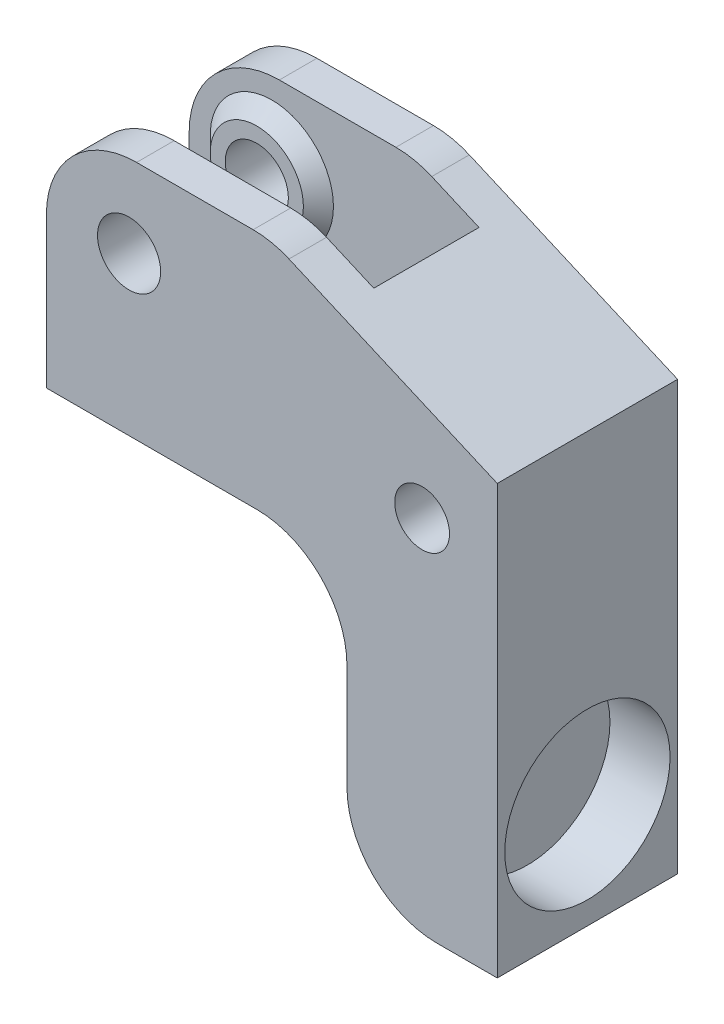
ISO-10303-21;
HEADER;
FILE_DESCRIPTION(('STEP AP214'),'2;1');
FILE_NAME('part.step','',(''),(''),'','','');
FILE_SCHEMA(('AUTOMOTIVE_DESIGN { 1 0 10303 214 1 1 1 1 }'));
ENDSEC;
DATA;
#1=APPLICATION_CONTEXT('core data for automotive mechanical design processes');
#2=APPLICATION_PROTOCOL_DEFINITION('international standard','automotive_design',2000,#1);
#3=PRODUCT_CONTEXT('',#1,'mechanical');
#4=PRODUCT('Part','Part','',(#3));
#5=PRODUCT_RELATED_PRODUCT_CATEGORY('part','',(#4));
#6=PRODUCT_DEFINITION_FORMATION('','',#4);
#7=PRODUCT_DEFINITION_CONTEXT('part definition',#1,'design');
#8=PRODUCT_DEFINITION('design','',#6,#7);
#9=PRODUCT_DEFINITION_SHAPE('','',#8);
#10=(LENGTH_UNIT() NAMED_UNIT(*) SI_UNIT(.MILLI.,.METRE.));
#11=(NAMED_UNIT(*) PLANE_ANGLE_UNIT() SI_UNIT($,.RADIAN.));
#12=(NAMED_UNIT(*) SI_UNIT($,.STERADIAN.) SOLID_ANGLE_UNIT());
#13=UNCERTAINTY_MEASURE_WITH_UNIT(LENGTH_MEASURE(1.E-05),#10,'distance_accuracy_value','');
#14=(GEOMETRIC_REPRESENTATION_CONTEXT(3) GLOBAL_UNCERTAINTY_ASSIGNED_CONTEXT((#13)) GLOBAL_UNIT_ASSIGNED_CONTEXT((#10,
#11,#12)) REPRESENTATION_CONTEXT('',''));
#15=CARTESIAN_POINT('',(0.,0.,0.));
#16=DIRECTION('',(0.,0.,1.));
#17=DIRECTION('',(1.,0.,0.));
#18=AXIS2_PLACEMENT_3D('',#15,#16,#17);
#19=CARTESIAN_POINT('',(0.,0.,2.5));
#20=DIRECTION('',(0.,0.,1.));
#21=DIRECTION('',(1.,0.,0.));
#22=AXIS2_PLACEMENT_3D('',#19,#20,#21);
#23=PLANE('',#22);
#24=DIRECTION('',(-0.917555625309924,0.397607437634301,0.));
#25=VECTOR('',#24,1.);
#26=CARTESIAN_POINT('',(15.,16.,2.5));
#27=LINE('',#26,#25);
#28=CARTESIAN_POINT('',(19.2848283626373,14.1432410428572,2.5));
#29=VERTEX_POINT('',#28);
#30=CARTESIAN_POINT('',(16.1415374957087,15.5053337518595,2.5));
#31=VERTEX_POINT('',#30);
#32=EDGE_CURVE('E202',#29,#31,#27,.T.);
#33=ORIENTED_EDGE('',*,*,#32,.T.);
#34=CARTESIAN_POINT('',(13.7558928699029,10.,2.5));
#35=DIRECTION('',(0.,0.,1.));
#36=DIRECTION('',(1.,0.,0.));
#37=AXIS2_PLACEMENT_3D('',#34,#35,#36);
#38=CIRCLE('',#37,6.);
#39=CARTESIAN_POINT('',(13.7558928699029,16.,2.5));
#40=VERTEX_POINT('',#39);
#41=EDGE_CURVE('E199',#40,#31,#38,.F.);
#42=ORIENTED_EDGE('',*,*,#41,.F.);
#43=DIRECTION('',(-1.,0.,0.));
#44=VECTOR('',#43,1.);
#45=CARTESIAN_POINT('',(0.,16.,2.5));
#46=LINE('',#45,#44);
#47=CARTESIAN_POINT('',(6.,16.,2.5));
#48=VERTEX_POINT('',#47);
#49=EDGE_CURVE('E197',#40,#48,#46,.T.);
#50=ORIENTED_EDGE('',*,*,#49,.T.);
#51=CARTESIAN_POINT('',(6.,10.,2.5));
#52=DIRECTION('',(0.,0.,1.));
#53=DIRECTION('',(1.,0.,0.));
#54=AXIS2_PLACEMENT_3D('',#51,#52,#53);
#55=CIRCLE('',#54,6.);
#56=CARTESIAN_POINT('',(0.,10.,2.5));
#57=VERTEX_POINT('',#56);
#58=EDGE_CURVE('E303',#57,#48,#55,.F.);
#59=ORIENTED_EDGE('',*,*,#58,.F.);
#60=DIRECTION('',(0.,1.,0.));
#61=VECTOR('',#60,1.);
#62=CARTESIAN_POINT('',(0.,2.,2.5));
#63=LINE('',#62,#61);
#64=CARTESIAN_POINT('',(0.,2.,2.5));
#65=VERTEX_POINT('',#64);
#66=EDGE_CURVE('E183',#65,#57,#63,.T.);
#67=ORIENTED_EDGE('',*,*,#66,.F.);
#68=DIRECTION('',(-1.,0.,0.));
#69=VECTOR('',#68,1.);
#70=CARTESIAN_POINT('',(12.,2.,2.5));
#71=LINE('',#70,#69);
#72=CARTESIAN_POINT('',(12.,2.,2.5));
#73=VERTEX_POINT('',#72);
#74=EDGE_CURVE('E190',#73,#65,#71,.T.);
#75=ORIENTED_EDGE('',*,*,#74,.F.);
#76=DIRECTION('',(-0.514437792541648,-0.857527700779908,0.));
#77=VECTOR('',#76,1.);
#78=CARTESIAN_POINT('',(22.,18.669220520195,2.5));
#79=LINE('',#78,#77);
#80=EDGE_CURVE('E175',#29,#73,#79,.T.);
#81=ORIENTED_EDGE('',*,*,#80,.F.);
#82=EDGE_LOOP('',(#33,#42,#50,#59,#67,#75,#81));
#83=FACE_BOUND('',#82,.T.);
#84=CARTESIAN_POINT('',(5.5,10.5,2.5));
#85=DIRECTION('',(0.,0.,1.));
#86=DIRECTION('',(1.,0.,0.));
#87=AXIS2_PLACEMENT_3D('',#84,#85,#86);
#88=CIRCLE('',#87,4.09999999999999);
#89=CARTESIAN_POINT('',(9.59999999999999,10.5,2.5));
#90=VERTEX_POINT('',#89);
#91=EDGE_CURVE('E344',#90,#90,#88,.T.);
#92=ORIENTED_EDGE('',*,*,#91,.F.);
#93=EDGE_LOOP('',(#92));
#94=FACE_BOUND('',#93,.T.);
#95=ADVANCED_FACE('F34',(#83,#94),#23,.T.);
#96=CARTESIAN_POINT('',(0.,0.,9.5));
#97=DIRECTION('',(0.,0.,1.));
#98=DIRECTION('',(1.,0.,0.));
#99=AXIS2_PLACEMENT_3D('',#96,#97,#98);
#100=PLANE('',#99);
#101=DIRECTION('',(-0.514437792541648,-0.857527700779908,0.));
#102=VECTOR('',#101,1.);
#103=CARTESIAN_POINT('',(22.,18.669220520195,9.5));
#104=LINE('',#103,#102);
#105=CARTESIAN_POINT('',(19.2848283626373,14.1432410428572,9.5));
#106=VERTEX_POINT('',#105);
#107=CARTESIAN_POINT('',(12.,2.,9.5));
#108=VERTEX_POINT('',#107);
#109=EDGE_CURVE('E160',#106,#108,#104,.T.);
#110=ORIENTED_EDGE('',*,*,#109,.T.);
#111=DIRECTION('',(-1.,0.,0.));
#112=VECTOR('',#111,1.);
#113=CARTESIAN_POINT('',(12.,2.,9.5));
#114=LINE('',#113,#112);
#115=CARTESIAN_POINT('',(0.,2.,9.5));
#116=VERTEX_POINT('',#115);
#117=EDGE_CURVE('E165',#108,#116,#114,.T.);
#118=ORIENTED_EDGE('',*,*,#117,.T.);
#119=DIRECTION('',(0.,1.,0.));
#120=VECTOR('',#119,1.);
#121=CARTESIAN_POINT('',(0.,2.,9.5));
#122=LINE('',#121,#120);
#123=CARTESIAN_POINT('',(0.,10.,9.5));
#124=VERTEX_POINT('',#123);
#125=EDGE_CURVE('E49',#116,#124,#122,.T.);
#126=ORIENTED_EDGE('',*,*,#125,.T.);
#127=CARTESIAN_POINT('',(6.,10.,9.5));
#128=DIRECTION('',(0.,0.,1.));
#129=DIRECTION('',(1.,0.,0.));
#130=AXIS2_PLACEMENT_3D('',#127,#128,#129);
#131=CIRCLE('',#130,6.);
#132=CARTESIAN_POINT('',(6.,16.,9.5));
#133=VERTEX_POINT('',#132);
#134=EDGE_CURVE('E301',#124,#133,#131,.F.);
#135=ORIENTED_EDGE('',*,*,#134,.T.);
#136=DIRECTION('',(-1.,0.,0.));
#137=VECTOR('',#136,1.);
#138=CARTESIAN_POINT('',(0.,16.,9.5));
#139=LINE('',#138,#137);
#140=CARTESIAN_POINT('',(13.7558928699029,16.,9.5));
#141=VERTEX_POINT('',#140);
#142=EDGE_CURVE('E178',#141,#133,#139,.T.);
#143=ORIENTED_EDGE('',*,*,#142,.F.);
#144=CARTESIAN_POINT('',(13.7558928699029,10.,9.5));
#145=DIRECTION('',(0.,0.,1.));
#146=DIRECTION('',(1.,0.,0.));
#147=AXIS2_PLACEMENT_3D('',#144,#145,#146);
#148=CIRCLE('',#147,6.);
#149=CARTESIAN_POINT('',(16.1415374957087,15.5053337518595,9.5));
#150=VERTEX_POINT('',#149);
#151=EDGE_CURVE('E194',#141,#150,#148,.F.);
#152=ORIENTED_EDGE('',*,*,#151,.T.);
#153=DIRECTION('',(-0.917555625309924,0.397607437634301,0.));
#154=VECTOR('',#153,1.);
#155=CARTESIAN_POINT('',(15.,16.,9.5));
#156=LINE('',#155,#154);
#157=EDGE_CURVE('E167',#106,#150,#156,.T.);
#158=ORIENTED_EDGE('',*,*,#157,.F.);
#159=EDGE_LOOP('',(#110,#118,#126,#135,#143,#152,#158));
#160=FACE_BOUND('',#159,.T.);
#161=CARTESIAN_POINT('',(5.5,10.5,9.5));
#162=DIRECTION('',(0.,0.,1.));
#163=DIRECTION('',(1.,0.,0.));
#164=AXIS2_PLACEMENT_3D('',#161,#162,#163);
#165=CIRCLE('',#164,4.09999999999999);
#166=CARTESIAN_POINT('',(9.59999999999999,10.5,9.5));
#167=VERTEX_POINT('',#166);
#168=EDGE_CURVE('E11',#167,#167,#165,.F.);
#169=ORIENTED_EDGE('',*,*,#168,.F.);
#170=EDGE_LOOP('',(#169));
#171=FACE_BOUND('',#170,.T.);
#172=ADVANCED_FACE('F162',(#160,#171),#100,.F.);
#173=CARTESIAN_POINT('',(0.,0.,12.));
#174=DIRECTION('',(1.,0.,0.));
#175=DIRECTION('',(0.,0.,-1.));
#176=AXIS2_PLACEMENT_3D('',#173,#174,#175);
#177=PLANE('',#176);
#178=ORIENTED_EDGE('',*,*,#66,.T.);
#179=DIRECTION('',(0.,0.,-1.));
#180=VECTOR('',#179,1.);
#181=CARTESIAN_POINT('',(0.,10.,12.));
#182=LINE('',#181,#180);
#183=CARTESIAN_POINT('',(0.,10.,0.));
#184=VERTEX_POINT('',#183);
#185=EDGE_CURVE('E293',#57,#184,#182,.T.);
#186=ORIENTED_EDGE('',*,*,#185,.T.);
#187=DIRECTION('',(0.,-1.,0.));
#188=VECTOR('',#187,1.);
#189=CARTESIAN_POINT('',(0.,0.,0.));
#190=LINE('',#189,#188);
#191=CARTESIAN_POINT('',(0.,0.,0.));
#192=VERTEX_POINT('',#191);
#193=EDGE_CURVE('E214',#184,#192,#190,.T.);
#194=ORIENTED_EDGE('',*,*,#193,.T.);
#195=DIRECTION('',(0.,0.,-1.));
#196=VECTOR('',#195,1.);
#197=CARTESIAN_POINT('',(0.,0.,12.));
#198=LINE('',#197,#196);
#199=CARTESIAN_POINT('',(0.,0.,12.));
#200=VERTEX_POINT('',#199);
#201=EDGE_CURVE('E257',#200,#192,#198,.T.);
#202=ORIENTED_EDGE('',*,*,#201,.F.);
#203=DIRECTION('',(0.,-1.,0.));
#204=VECTOR('',#203,1.);
#205=CARTESIAN_POINT('',(0.,0.,12.));
#206=LINE('',#205,#204);
#207=CARTESIAN_POINT('',(0.,10.,12.));
#208=VERTEX_POINT('',#207);
#209=EDGE_CURVE('E217',#208,#200,#206,.T.);
#210=ORIENTED_EDGE('',*,*,#209,.F.);
#211=EDGE_CURVE('E294',#208,#124,#182,.T.);
#212=ORIENTED_EDGE('',*,*,#211,.T.);
#213=ORIENTED_EDGE('',*,*,#125,.F.);
#214=DIRECTION('',(0.,0.,1.));
#215=VECTOR('',#214,1.);
#216=CARTESIAN_POINT('',(0.,2.,2.5));
#217=LINE('',#216,#215);
#218=EDGE_CURVE('E179',#65,#116,#217,.T.);
#219=ORIENTED_EDGE('',*,*,#218,.F.);
#220=EDGE_LOOP('',(#178,#186,#194,#202,#210,#212,#213,#219));
#221=FACE_BOUND('',#220,.T.);
#222=ADVANCED_FACE('F328',(#221),#177,.F.);
#223=CARTESIAN_POINT('',(15.,16.,12.));
#224=DIRECTION('',(-0.397607437634301,-0.917555625309924,0.));
#225=DIRECTION('',(0.917555625309924,-0.397607437634301,0.));
#226=AXIS2_PLACEMENT_3D('',#223,#224,#225);
#227=PLANE('',#226);
#228=ORIENTED_EDGE('',*,*,#32,.F.);
#229=DIRECTION('',(0.,0.,-1.));
#230=VECTOR('',#229,1.);
#231=CARTESIAN_POINT('',(19.2848283626373,14.1432410428572,12.));
#232=LINE('',#231,#230);
#233=EDGE_CURVE('E42',#106,#29,#232,.T.);
#234=ORIENTED_EDGE('',*,*,#233,.F.);
#235=ORIENTED_EDGE('',*,*,#157,.T.);
#236=DIRECTION('',(0.,0.,-1.));
#237=VECTOR('',#236,1.);
#238=CARTESIAN_POINT('',(16.1415374957087,15.5053337518595,12.));
#239=LINE('',#238,#237);
#240=CARTESIAN_POINT('',(16.1415374957087,15.5053337518595,12.));
#241=VERTEX_POINT('',#240);
#242=EDGE_CURVE('E289',#150,#241,#239,.F.);
#243=ORIENTED_EDGE('',*,*,#242,.T.);
#244=DIRECTION('',(-0.917555625309924,0.397607437634301,0.));
#245=VECTOR('',#244,1.);
#246=CARTESIAN_POINT('',(15.,16.,12.));
#247=LINE('',#246,#245);
#248=CARTESIAN_POINT('',(30.,9.5,12.));
#249=VERTEX_POINT('',#248);
#250=EDGE_CURVE('E230',#249,#241,#247,.T.);
#251=ORIENTED_EDGE('',*,*,#250,.F.);
#252=DIRECTION('',(0.,0.,-1.));
#253=VECTOR('',#252,1.);
#254=CARTESIAN_POINT('',(30.,9.5,12.));
#255=LINE('',#254,#253);
#256=CARTESIAN_POINT('',(30.,9.5,0.));
#257=VERTEX_POINT('',#256);
#258=EDGE_CURVE('E235',#249,#257,#255,.T.);
#259=ORIENTED_EDGE('',*,*,#258,.T.);
#260=DIRECTION('',(-0.917555625309924,0.397607437634301,0.));
#261=VECTOR('',#260,1.);
#262=CARTESIAN_POINT('',(15.,16.,0.));
#263=LINE('',#262,#261);
#264=CARTESIAN_POINT('',(16.1415374957087,15.5053337518595,0.));
#265=VERTEX_POINT('',#264);
#266=EDGE_CURVE('E247',#257,#265,#263,.T.);
#267=ORIENTED_EDGE('',*,*,#266,.T.);
#268=EDGE_CURVE('E290',#265,#31,#239,.F.);
#269=ORIENTED_EDGE('',*,*,#268,.T.);
#270=EDGE_LOOP('',(#228,#234,#235,#243,#251,#259,#267,#269));
#271=FACE_BOUND('',#270,.T.);
#272=ADVANCED_FACE('F310',(#271),#227,.F.);
#273=CARTESIAN_POINT('',(0.,16.,12.));
#274=DIRECTION('',(0.,-1.,0.));
#275=DIRECTION('',(0.,0.,-1.));
#276=AXIS2_PLACEMENT_3D('',#273,#274,#275);
#277=PLANE('',#276);
#278=ORIENTED_EDGE('',*,*,#49,.F.);
#279=DIRECTION('',(0.,0.,-1.));
#280=VECTOR('',#279,1.);
#281=CARTESIAN_POINT('',(13.7558928699029,16.,12.));
#282=LINE('',#281,#280);
#283=CARTESIAN_POINT('',(13.7558928699029,16.,0.));
#284=VERTEX_POINT('',#283);
#285=EDGE_CURVE('E285',#40,#284,#282,.T.);
#286=ORIENTED_EDGE('',*,*,#285,.T.);
#287=DIRECTION('',(-1.,0.,0.));
#288=VECTOR('',#287,1.);
#289=CARTESIAN_POINT('',(0.,16.,0.));
#290=LINE('',#289,#288);
#291=CARTESIAN_POINT('',(6.,16.,0.));
#292=VERTEX_POINT('',#291);
#293=EDGE_CURVE('E220',#284,#292,#290,.T.);
#294=ORIENTED_EDGE('',*,*,#293,.T.);
#295=DIRECTION('',(0.,0.,-1.));
#296=VECTOR('',#295,1.);
#297=CARTESIAN_POINT('',(6.,16.,12.));
#298=LINE('',#297,#296);
#299=EDGE_CURVE('E282',#292,#48,#298,.F.);
#300=ORIENTED_EDGE('',*,*,#299,.T.);
#301=EDGE_LOOP('',(#278,#286,#294,#300));
#302=FACE_BOUND('',#301,.T.);
#303=ADVANCED_FACE('F320',(#302),#277,.F.);
#304=CARTESIAN_POINT('',(5.5,10.5,12.));
#305=DIRECTION('',(0.,0.,-1.));
#306=DIRECTION('',(-1.,0.,0.));
#307=AXIS2_PLACEMENT_3D('',#304,#305,#306);
#308=CYLINDRICAL_SURFACE('',#307,2.1);
#309=CARTESIAN_POINT('',(5.5,10.5,0.));
#310=DIRECTION('',(0.,0.,1.));
#311=DIRECTION('',(1.,0.,0.));
#312=AXIS2_PLACEMENT_3D('',#309,#310,#311);
#313=CIRCLE('',#312,2.1);
#314=CARTESIAN_POINT('',(7.6,10.5,0.));
#315=VERTEX_POINT('',#314);
#316=EDGE_CURVE('E204',#315,#315,#313,.T.);
#317=ORIENTED_EDGE('',*,*,#316,.F.);
#318=EDGE_LOOP('',(#317));
#319=FACE_BOUND('',#318,.T.);
#320=CARTESIAN_POINT('',(5.5,10.5,3.5));
#321=DIRECTION('',(0.,0.,1.));
#322=DIRECTION('',(1.,0.,0.));
#323=AXIS2_PLACEMENT_3D('',#320,#321,#322);
#324=CIRCLE('',#323,2.1);
#325=CARTESIAN_POINT('',(7.6,10.5,3.5));
#326=VERTEX_POINT('',#325);
#327=EDGE_CURVE('E338',#326,#326,#324,.T.);
#328=ORIENTED_EDGE('',*,*,#327,.T.);
#329=EDGE_LOOP('',(#328));
#330=FACE_BOUND('',#329,.T.);
#331=ADVANCED_FACE('F433',(#319,#330),#308,.F.);
#332=CARTESIAN_POINT('',(13.7558928699029,10.,12.));
#333=DIRECTION('',(0.,0.,-1.));
#334=DIRECTION('',(-1.,0.,0.));
#335=AXIS2_PLACEMENT_3D('',#332,#333,#334);
#336=CYLINDRICAL_SURFACE('',#335,6.);
#337=ORIENTED_EDGE('',*,*,#285,.F.);
#338=ORIENTED_EDGE('',*,*,#41,.T.);
#339=ORIENTED_EDGE('',*,*,#268,.F.);
#340=CARTESIAN_POINT('',(13.7558928699029,10.,0.));
#341=DIRECTION('',(0.,0.,-1.));
#342=DIRECTION('',(-1.,0.,0.));
#343=AXIS2_PLACEMENT_3D('',#340,#341,#342);
#344=CIRCLE('',#343,6.);
#345=EDGE_CURVE('E265',#284,#265,#344,.T.);
#346=ORIENTED_EDGE('',*,*,#345,.F.);
#347=EDGE_LOOP('',(#337,#338,#339,#346));
#348=FACE_BOUND('',#347,.T.);
#349=ADVANCED_FACE('F316',(#348),#336,.T.);
#350=CARTESIAN_POINT('',(6.,10.,12.));
#351=DIRECTION('',(0.,0.,-1.));
#352=DIRECTION('',(-1.,0.,0.));
#353=AXIS2_PLACEMENT_3D('',#350,#351,#352);
#354=CYLINDRICAL_SURFACE('',#353,6.);
#355=ORIENTED_EDGE('',*,*,#185,.F.);
#356=ORIENTED_EDGE('',*,*,#58,.T.);
#357=ORIENTED_EDGE('',*,*,#299,.F.);
#358=CARTESIAN_POINT('',(6.,10.,0.));
#359=DIRECTION('',(0.,0.,-1.));
#360=DIRECTION('',(-1.,0.,0.));
#361=AXIS2_PLACEMENT_3D('',#358,#359,#360);
#362=CIRCLE('',#361,6.);
#363=EDGE_CURVE('E263',#184,#292,#362,.T.);
#364=ORIENTED_EDGE('',*,*,#363,.F.);
#365=EDGE_LOOP('',(#355,#356,#357,#364));
#366=FACE_BOUND('',#365,.T.);
#367=ADVANCED_FACE('F325',(#366),#354,.T.);
#368=CARTESIAN_POINT('',(0.,0.,12.));
#369=DIRECTION('',(0.,0.,-1.));
#370=DIRECTION('',(-1.,0.,0.));
#371=AXIS2_PLACEMENT_3D('',#368,#369,#370);
#372=PLANE('',#371);
#373=CARTESIAN_POINT('',(25.,5.,12.));
#374=DIRECTION('',(0.,0.,1.));
#375=DIRECTION('',(1.,0.,0.));
#376=AXIS2_PLACEMENT_3D('',#373,#374,#375);
#377=CIRCLE('',#376,1.8222160837051);
#378=CARTESIAN_POINT('',(26.8222160837051,5.,12.));
#379=VERTEX_POINT('',#378);
#380=EDGE_CURVE('E211',#379,#379,#377,.T.);
#381=ORIENTED_EDGE('',*,*,#380,.F.);
#382=EDGE_LOOP('',(#381));
#383=FACE_BOUND('',#382,.T.);
#384=DIRECTION('',(0.,-1.,0.));
#385=VECTOR('',#384,1.);
#386=CARTESIAN_POINT('',(20.,0.,12.));
#387=LINE('',#386,#385);
#388=CARTESIAN_POINT('',(20.,-6.,12.));
#389=VERTEX_POINT('',#388);
#390=CARTESIAN_POINT('',(20.,-13.,12.));
#391=VERTEX_POINT('',#390);
#392=EDGE_CURVE('E223',#389,#391,#387,.T.);
#393=ORIENTED_EDGE('',*,*,#392,.T.);
#394=CARTESIAN_POINT('',(26.,-13.,12.));
#395=DIRECTION('',(0.,0.,-1.));
#396=DIRECTION('',(-1.,0.,0.));
#397=AXIS2_PLACEMENT_3D('',#394,#395,#396);
#398=CIRCLE('',#397,6.);
#399=CARTESIAN_POINT('',(26.,-19.,12.));
#400=VERTEX_POINT('',#399);
#401=EDGE_CURVE('E278',#391,#400,#398,.F.);
#402=ORIENTED_EDGE('',*,*,#401,.T.);
#403=DIRECTION('',(1.,0.,0.));
#404=VECTOR('',#403,1.);
#405=CARTESIAN_POINT('',(20.,-19.,12.));
#406=LINE('',#405,#404);
#407=CARTESIAN_POINT('',(30.,-19.,12.));
#408=VERTEX_POINT('',#407);
#409=EDGE_CURVE('E226',#400,#408,#406,.T.);
#410=ORIENTED_EDGE('',*,*,#409,.T.);
#411=DIRECTION('',(0.,1.,0.));
#412=VECTOR('',#411,1.);
#413=CARTESIAN_POINT('',(30.,-19.,12.));
#414=LINE('',#413,#412);
#415=EDGE_CURVE('E228',#408,#249,#414,.T.);
#416=ORIENTED_EDGE('',*,*,#415,.T.);
#417=ORIENTED_EDGE('',*,*,#250,.T.);
#418=CARTESIAN_POINT('',(13.7558928699029,10.,12.));
#419=DIRECTION('',(0.,0.,-1.));
#420=DIRECTION('',(-1.,0.,0.));
#421=AXIS2_PLACEMENT_3D('',#418,#419,#420);
#422=CIRCLE('',#421,6.);
#423=CARTESIAN_POINT('',(13.7558928699029,16.,12.));
#424=VERTEX_POINT('',#423);
#425=EDGE_CURVE('E276',#241,#424,#422,.F.);
#426=ORIENTED_EDGE('',*,*,#425,.T.);
#427=DIRECTION('',(-1.,0.,0.));
#428=VECTOR('',#427,1.);
#429=CARTESIAN_POINT('',(0.,16.,12.));
#430=LINE('',#429,#428);
#431=CARTESIAN_POINT('',(6.,16.,12.));
#432=VERTEX_POINT('',#431);
#433=EDGE_CURVE('E233',#424,#432,#430,.T.);
#434=ORIENTED_EDGE('',*,*,#433,.T.);
#435=CARTESIAN_POINT('',(6.,10.,12.));
#436=DIRECTION('',(0.,0.,-1.));
#437=DIRECTION('',(-1.,0.,0.));
#438=AXIS2_PLACEMENT_3D('',#435,#436,#437);
#439=CIRCLE('',#438,6.);
#440=EDGE_CURVE('E274',#432,#208,#439,.F.);
#441=ORIENTED_EDGE('',*,*,#440,.T.);
#442=ORIENTED_EDGE('',*,*,#209,.T.);
#443=DIRECTION('',(1.,0.,0.));
#444=VECTOR('',#443,1.);
#445=CARTESIAN_POINT('',(0.,0.,12.));
#446=LINE('',#445,#444);
#447=CARTESIAN_POINT('',(14.,0.,12.));
#448=VERTEX_POINT('',#447);
#449=EDGE_CURVE('E219',#200,#448,#446,.T.);
#450=ORIENTED_EDGE('',*,*,#449,.T.);
#451=CARTESIAN_POINT('',(14.,-6.,12.));
#452=DIRECTION('',(0.,0.,-1.));
#453=DIRECTION('',(-1.,0.,0.));
#454=AXIS2_PLACEMENT_3D('',#451,#452,#453);
#455=CIRCLE('',#454,6.);
#456=EDGE_CURVE('E299',#448,#389,#455,.T.);
#457=ORIENTED_EDGE('',*,*,#456,.T.);
#458=EDGE_LOOP('',(#393,#402,#410,#416,#417,#426,#434,#441,#442,#450,#457));
#459=FACE_BOUND('',#458,.T.);
#460=CARTESIAN_POINT('',(5.5,10.5,12.));
#461=DIRECTION('',(0.,0.,1.));
#462=DIRECTION('',(1.,0.,0.));
#463=AXIS2_PLACEMENT_3D('',#460,#461,#462);
#464=CIRCLE('',#463,2.1);
#465=CARTESIAN_POINT('',(7.6,10.5,12.));
#466=VERTEX_POINT('',#465);
#467=EDGE_CURVE('E205',#466,#466,#464,.T.);
#468=ORIENTED_EDGE('',*,*,#467,.F.);
#469=EDGE_LOOP('',(#468));
#470=FACE_BOUND('',#469,.T.);
#471=ADVANCED_FACE('F386',(#383,#459,#470),#372,.F.);
#472=CARTESIAN_POINT('',(0.,0.,0.));
#473=DIRECTION('',(0.,0.,-1.));
#474=DIRECTION('',(-1.,0.,0.));
#475=AXIS2_PLACEMENT_3D('',#472,#473,#474);
#476=PLANE('',#475);
#477=CARTESIAN_POINT('',(25.,5.,0.));
#478=DIRECTION('',(0.,0.,1.));
#479=DIRECTION('',(1.,0.,0.));
#480=AXIS2_PLACEMENT_3D('',#477,#478,#479);
#481=CIRCLE('',#480,1.8222160837051);
#482=CARTESIAN_POINT('',(26.8222160837051,5.,0.));
#483=VERTEX_POINT('',#482);
#484=EDGE_CURVE('E208',#483,#483,#481,.T.);
#485=ORIENTED_EDGE('',*,*,#484,.T.);
#486=EDGE_LOOP('',(#485));
#487=FACE_BOUND('',#486,.T.);
#488=DIRECTION('',(1.,0.,0.));
#489=VECTOR('',#488,1.);
#490=CARTESIAN_POINT('',(20.,-19.,0.));
#491=LINE('',#490,#489);
#492=CARTESIAN_POINT('',(26.,-19.,0.));
#493=VERTEX_POINT('',#492);
#494=CARTESIAN_POINT('',(30.,-19.,0.));
#495=VERTEX_POINT('',#494);
#496=EDGE_CURVE('E243',#493,#495,#491,.T.);
#497=ORIENTED_EDGE('',*,*,#496,.F.);
#498=CARTESIAN_POINT('',(26.,-13.,0.));
#499=DIRECTION('',(0.,0.,-1.));
#500=DIRECTION('',(-1.,0.,0.));
#501=AXIS2_PLACEMENT_3D('',#498,#499,#500);
#502=CIRCLE('',#501,6.);
#503=CARTESIAN_POINT('',(20.,-13.,0.));
#504=VERTEX_POINT('',#503);
#505=EDGE_CURVE('E267',#493,#504,#502,.T.);
#506=ORIENTED_EDGE('',*,*,#505,.T.);
#507=DIRECTION('',(0.,-1.,0.));
#508=VECTOR('',#507,1.);
#509=CARTESIAN_POINT('',(20.,0.,0.));
#510=LINE('',#509,#508);
#511=CARTESIAN_POINT('',(20.,-6.,0.));
#512=VERTEX_POINT('',#511);
#513=EDGE_CURVE('E240',#512,#504,#510,.T.);
#514=ORIENTED_EDGE('',*,*,#513,.F.);
#515=CARTESIAN_POINT('',(14.,-6.,0.));
#516=DIRECTION('',(0.,0.,-1.));
#517=DIRECTION('',(-1.,0.,0.));
#518=AXIS2_PLACEMENT_3D('',#515,#516,#517);
#519=CIRCLE('',#518,6.);
#520=CARTESIAN_POINT('',(14.,0.,0.));
#521=VERTEX_POINT('',#520);
#522=EDGE_CURVE('E297',#512,#521,#519,.F.);
#523=ORIENTED_EDGE('',*,*,#522,.T.);
#524=DIRECTION('',(1.,0.,0.));
#525=VECTOR('',#524,1.);
#526=CARTESIAN_POINT('',(0.,0.,0.));
#527=LINE('',#526,#525);
#528=EDGE_CURVE('E237',#192,#521,#527,.T.);
#529=ORIENTED_EDGE('',*,*,#528,.F.);
#530=ORIENTED_EDGE('',*,*,#193,.F.);
#531=ORIENTED_EDGE('',*,*,#363,.T.);
#532=ORIENTED_EDGE('',*,*,#293,.F.);
#533=ORIENTED_EDGE('',*,*,#345,.T.);
#534=ORIENTED_EDGE('',*,*,#266,.F.);
#535=DIRECTION('',(0.,1.,0.));
#536=VECTOR('',#535,1.);
#537=CARTESIAN_POINT('',(30.,-19.,0.));
#538=LINE('',#537,#536);
#539=EDGE_CURVE('E245',#495,#257,#538,.T.);
#540=ORIENTED_EDGE('',*,*,#539,.F.);
#541=EDGE_LOOP('',(#497,#506,#514,#523,#529,#530,#531,#532,#533,#534,#540));
#542=FACE_BOUND('',#541,.T.);
#543=ORIENTED_EDGE('',*,*,#316,.T.);
#544=EDGE_LOOP('',(#543));
#545=FACE_BOUND('',#544,.T.);
#546=ADVANCED_FACE('F376',(#487,#542,#545),#476,.T.);
#547=CARTESIAN_POINT('',(0.,0.,12.));
#548=DIRECTION('',(0.,1.,0.));
#549=DIRECTION('',(0.,0.,1.));
#550=AXIS2_PLACEMENT_3D('',#547,#548,#549);
#551=PLANE('',#550);
#552=ORIENTED_EDGE('',*,*,#528,.T.);
#553=DIRECTION('',(0.,0.,-1.));
#554=VECTOR('',#553,1.);
#555=CARTESIAN_POINT('',(14.,0.,12.));
#556=LINE('',#555,#554);
#557=EDGE_CURVE('E280',#521,#448,#556,.F.);
#558=ORIENTED_EDGE('',*,*,#557,.T.);
#559=ORIENTED_EDGE('',*,*,#449,.F.);
#560=ORIENTED_EDGE('',*,*,#201,.T.);
#561=EDGE_LOOP('',(#552,#558,#559,#560));
#562=FACE_BOUND('',#561,.T.);
#563=ADVANCED_FACE('F382',(#562),#551,.F.);
#564=CARTESIAN_POINT('',(20.,0.,12.));
#565=DIRECTION('',(1.,0.,0.));
#566=DIRECTION('',(0.,1.,0.));
#567=AXIS2_PLACEMENT_3D('',#564,#565,#566);
#568=PLANE('',#567);
#569=ORIENTED_EDGE('',*,*,#513,.T.);
#570=DIRECTION('',(0.,0.,-1.));
#571=VECTOR('',#570,1.);
#572=CARTESIAN_POINT('',(20.,-13.,12.));
#573=LINE('',#572,#571);
#574=EDGE_CURVE('E272',#504,#391,#573,.F.);
#575=ORIENTED_EDGE('',*,*,#574,.T.);
#576=ORIENTED_EDGE('',*,*,#392,.F.);
#577=DIRECTION('',(0.,0.,-1.));
#578=VECTOR('',#577,1.);
#579=CARTESIAN_POINT('',(20.,-6.,0.));
#580=LINE('',#579,#578);
#581=EDGE_CURVE('E269',#389,#512,#580,.T.);
#582=ORIENTED_EDGE('',*,*,#581,.T.);
#583=EDGE_LOOP('',(#569,#575,#576,#582));
#584=FACE_BOUND('',#583,.T.);
#585=ADVANCED_FACE('F394',(#584),#568,.F.);
#586=CARTESIAN_POINT('',(20.,-19.,12.));
#587=DIRECTION('',(0.,1.,0.));
#588=DIRECTION('',(0.,0.,1.));
#589=AXIS2_PLACEMENT_3D('',#586,#587,#588);
#590=PLANE('',#589);
#591=ORIENTED_EDGE('',*,*,#409,.F.);
#592=DIRECTION('',(0.,0.,-1.));
#593=VECTOR('',#592,1.);
#594=CARTESIAN_POINT('',(26.,-19.,12.));
#595=LINE('',#594,#593);
#596=EDGE_CURVE('E260',#400,#493,#595,.T.);
#597=ORIENTED_EDGE('',*,*,#596,.T.);
#598=ORIENTED_EDGE('',*,*,#496,.T.);
#599=DIRECTION('',(0.,0.,-1.));
#600=VECTOR('',#599,1.);
#601=CARTESIAN_POINT('',(30.,-19.,12.));
#602=LINE('',#601,#600);
#603=EDGE_CURVE('E254',#408,#495,#602,.T.);
#604=ORIENTED_EDGE('',*,*,#603,.F.);
#605=EDGE_LOOP('',(#591,#597,#598,#604));
#606=FACE_BOUND('',#605,.T.);
#607=ADVANCED_FACE('F367',(#606),#590,.F.);
#608=CARTESIAN_POINT('',(30.,-19.,12.));
#609=DIRECTION('',(-1.,0.,0.));
#610=DIRECTION('',(0.,0.,1.));
#611=AXIS2_PLACEMENT_3D('',#608,#609,#610);
#612=PLANE('',#611);
#613=CARTESIAN_POINT('',(30.,-12.,6.));
#614=DIRECTION('',(1.,0.,0.));
#615=DIRECTION('',(0.,0.,-1.));
#616=AXIS2_PLACEMENT_3D('',#613,#614,#615);
#617=CIRCLE('',#616,5.5);
#618=CARTESIAN_POINT('',(30.,-12.,0.5));
#619=VERTEX_POINT('',#618);
#620=EDGE_CURVE('E348',#619,#619,#617,.T.);
#621=ORIENTED_EDGE('',*,*,#620,.F.);
#622=EDGE_LOOP('',(#621));
#623=FACE_BOUND('',#622,.T.);
#624=ORIENTED_EDGE('',*,*,#539,.T.);
#625=ORIENTED_EDGE('',*,*,#258,.F.);
#626=ORIENTED_EDGE('',*,*,#415,.F.);
#627=ORIENTED_EDGE('',*,*,#603,.T.);
#628=EDGE_LOOP('',(#624,#625,#626,#627));
#629=FACE_BOUND('',#628,.T.);
#630=ADVANCED_FACE('F363',(#623,#629),#612,.F.);
#631=EDGE_CURVE('E286',#424,#141,#282,.T.);
#632=ORIENTED_EDGE('',*,*,#631,.T.);
#633=ORIENTED_EDGE('',*,*,#142,.T.);
#634=EDGE_CURVE('E57',#133,#432,#298,.F.);
#635=ORIENTED_EDGE('',*,*,#634,.T.);
#636=ORIENTED_EDGE('',*,*,#433,.F.);
#637=EDGE_LOOP('',(#632,#633,#635,#636));
#638=FACE_BOUND('',#637,.T.);
#639=ADVANCED_FACE('F366',(#638),#277,.F.);
#640=CARTESIAN_POINT('',(25.,5.,12.));
#641=DIRECTION('',(0.,0.,-1.));
#642=DIRECTION('',(-1.,0.,0.));
#643=AXIS2_PLACEMENT_3D('',#640,#641,#642);
#644=CYLINDRICAL_SURFACE('',#643,1.8222160837051);
#645=ORIENTED_EDGE('',*,*,#380,.T.);
#646=EDGE_LOOP('',(#645));
#647=FACE_BOUND('',#646,.T.);
#648=ORIENTED_EDGE('',*,*,#484,.F.);
#649=EDGE_LOOP('',(#648));
#650=FACE_BOUND('',#649,.T.);
#651=ADVANCED_FACE('F431',(#647,#650),#644,.F.);
#652=ORIENTED_EDGE('',*,*,#467,.T.);
#653=EDGE_LOOP('',(#652));
#654=FACE_BOUND('',#653,.T.);
#655=CARTESIAN_POINT('',(5.5,10.5,8.5));
#656=DIRECTION('',(0.,0.,1.));
#657=DIRECTION('',(1.,0.,0.));
#658=AXIS2_PLACEMENT_3D('',#655,#656,#657);
#659=CIRCLE('',#658,2.1);
#660=CARTESIAN_POINT('',(7.6,10.5,8.5));
#661=VERTEX_POINT('',#660);
#662=EDGE_CURVE('E331',#661,#661,#659,.T.);
#663=ORIENTED_EDGE('',*,*,#662,.F.);
#664=EDGE_LOOP('',(#663));
#665=FACE_BOUND('',#664,.T.);
#666=ADVANCED_FACE('F428',(#654,#665),#308,.F.);
#667=CARTESIAN_POINT('',(26.,-13.,12.));
#668=DIRECTION('',(0.,0.,-1.));
#669=DIRECTION('',(-1.,0.,0.));
#670=AXIS2_PLACEMENT_3D('',#667,#668,#669);
#671=CYLINDRICAL_SURFACE('',#670,6.);
#672=ORIENTED_EDGE('',*,*,#401,.F.);
#673=ORIENTED_EDGE('',*,*,#574,.F.);
#674=ORIENTED_EDGE('',*,*,#505,.F.);
#675=ORIENTED_EDGE('',*,*,#596,.F.);
#676=EDGE_LOOP('',(#672,#673,#674,#675));
#677=FACE_BOUND('',#676,.T.);
#678=ADVANCED_FACE('F399',(#677),#671,.T.);
#679=CARTESIAN_POINT('',(14.,-6.,12.));
#680=DIRECTION('',(0.,0.,1.));
#681=DIRECTION('',(1.,0.,0.));
#682=AXIS2_PLACEMENT_3D('',#679,#680,#681);
#683=CYLINDRICAL_SURFACE('',#682,6.);
#684=ORIENTED_EDGE('',*,*,#456,.F.);
#685=ORIENTED_EDGE('',*,*,#557,.F.);
#686=ORIENTED_EDGE('',*,*,#522,.F.);
#687=ORIENTED_EDGE('',*,*,#581,.F.);
#688=EDGE_LOOP('',(#684,#685,#686,#687));
#689=FACE_BOUND('',#688,.T.);
#690=ADVANCED_FACE('F391',(#689),#683,.F.);
#691=ORIENTED_EDGE('',*,*,#151,.F.);
#692=ORIENTED_EDGE('',*,*,#631,.F.);
#693=ORIENTED_EDGE('',*,*,#425,.F.);
#694=ORIENTED_EDGE('',*,*,#242,.F.);
#695=EDGE_LOOP('',(#691,#692,#693,#694));
#696=FACE_BOUND('',#695,.T.);
#697=ADVANCED_FACE('F407',(#696),#336,.T.);
#698=ORIENTED_EDGE('',*,*,#134,.F.);
#699=ORIENTED_EDGE('',*,*,#211,.F.);
#700=ORIENTED_EDGE('',*,*,#440,.F.);
#701=ORIENTED_EDGE('',*,*,#634,.F.);
#702=EDGE_LOOP('',(#698,#699,#700,#701));
#703=FACE_BOUND('',#702,.T.);
#704=ADVANCED_FACE('F36',(#703),#354,.T.);
#705=CARTESIAN_POINT('',(22.,18.669220520195,2.5));
#706=DIRECTION('',(-0.857527700779908,0.514437792541648,0.));
#707=DIRECTION('',(-0.514437792541648,-0.857527700779908,0.));
#708=AXIS2_PLACEMENT_3D('',#705,#706,#707);
#709=PLANE('',#708);
#710=ORIENTED_EDGE('',*,*,#233,.T.);
#711=ORIENTED_EDGE('',*,*,#80,.T.);
#712=DIRECTION('',(0.,0.,1.));
#713=VECTOR('',#712,1.);
#714=CARTESIAN_POINT('',(12.,2.,2.5));
#715=LINE('',#714,#713);
#716=EDGE_CURVE('E172',#73,#108,#715,.T.);
#717=ORIENTED_EDGE('',*,*,#716,.T.);
#718=ORIENTED_EDGE('',*,*,#109,.F.);
#719=EDGE_LOOP('',(#710,#711,#717,#718));
#720=FACE_BOUND('',#719,.T.);
#721=ADVANCED_FACE('F173',(#720),#709,.T.);
#722=CARTESIAN_POINT('',(12.,2.,2.5));
#723=DIRECTION('',(0.,1.,0.));
#724=DIRECTION('',(0.,0.,1.));
#725=AXIS2_PLACEMENT_3D('',#722,#723,#724);
#726=PLANE('',#725);
#727=ORIENTED_EDGE('',*,*,#716,.F.);
#728=ORIENTED_EDGE('',*,*,#74,.T.);
#729=ORIENTED_EDGE('',*,*,#218,.T.);
#730=ORIENTED_EDGE('',*,*,#117,.F.);
#731=EDGE_LOOP('',(#727,#728,#729,#730));
#732=FACE_BOUND('',#731,.T.);
#733=ADVANCED_FACE('F181',(#732),#726,.T.);
#734=CARTESIAN_POINT('',(5.5,12.6,8.5));
#735=DIRECTION('',(0.,0.,1.));
#736=DIRECTION('',(1.,0.,0.));
#737=AXIS2_PLACEMENT_3D('',#734,#735,#736);
#738=PLANE('',#737);
#739=CARTESIAN_POINT('',(5.5,10.5,8.5));
#740=DIRECTION('',(0.,0.,1.));
#741=DIRECTION('',(1.,0.,0.));
#742=AXIS2_PLACEMENT_3D('',#739,#740,#741);
#743=CIRCLE('',#742,3.1);
#744=CARTESIAN_POINT('',(8.6,10.5,8.5));
#745=VERTEX_POINT('',#744);
#746=EDGE_CURVE('E333',#745,#745,#743,.T.);
#747=ORIENTED_EDGE('',*,*,#746,.F.);
#748=EDGE_LOOP('',(#747));
#749=FACE_BOUND('',#748,.T.);
#750=ORIENTED_EDGE('',*,*,#662,.T.);
#751=EDGE_LOOP('',(#750));
#752=FACE_BOUND('',#751,.T.);
#753=ADVANCED_FACE('F426',(#749,#752),#738,.F.);
#754=CARTESIAN_POINT('',(5.5,10.5,8.5));
#755=DIRECTION('',(0.,0.,1.));
#756=DIRECTION('',(1.,0.,0.));
#757=AXIS2_PLACEMENT_3D('',#754,#755,#756);
#758=CONICAL_SURFACE('',#757,3.1,0.785398163397445);
#759=ORIENTED_EDGE('',*,*,#168,.T.);
#760=EDGE_LOOP('',(#759));
#761=FACE_BOUND('',#760,.T.);
#762=ORIENTED_EDGE('',*,*,#746,.T.);
#763=EDGE_LOOP('',(#762));
#764=FACE_BOUND('',#763,.T.);
#765=ADVANCED_FACE('F511',(#761,#764),#758,.T.);
#766=CARTESIAN_POINT('',(5.5,12.6,3.5));
#767=DIRECTION('',(0.,0.,-1.));
#768=DIRECTION('',(1.,0.,0.));
#769=AXIS2_PLACEMENT_3D('',#766,#767,#768);
#770=PLANE('',#769);
#771=CARTESIAN_POINT('',(5.5,10.5,3.5));
#772=DIRECTION('',(0.,0.,1.));
#773=DIRECTION('',(1.,0.,0.));
#774=AXIS2_PLACEMENT_3D('',#771,#772,#773);
#775=CIRCLE('',#774,3.1);
#776=CARTESIAN_POINT('',(8.6,10.5,3.5));
#777=VERTEX_POINT('',#776);
#778=EDGE_CURVE('E341',#777,#777,#775,.T.);
#779=ORIENTED_EDGE('',*,*,#778,.T.);
#780=EDGE_LOOP('',(#779));
#781=FACE_BOUND('',#780,.T.);
#782=ORIENTED_EDGE('',*,*,#327,.F.);
#783=EDGE_LOOP('',(#782));
#784=FACE_BOUND('',#783,.T.);
#785=ADVANCED_FACE('F519',(#781,#784),#770,.F.);
#786=CARTESIAN_POINT('',(5.5,10.5,3.5));
#787=DIRECTION('',(0.,0.,-1.));
#788=DIRECTION('',(1.,0.,0.));
#789=AXIS2_PLACEMENT_3D('',#786,#787,#788);
#790=CONICAL_SURFACE('',#789,3.1,0.785398163397445);
#791=ORIENTED_EDGE('',*,*,#91,.T.);
#792=EDGE_LOOP('',(#791));
#793=FACE_BOUND('',#792,.T.);
#794=ORIENTED_EDGE('',*,*,#778,.F.);
#795=EDGE_LOOP('',(#794));
#796=FACE_BOUND('',#795,.T.);
#797=ADVANCED_FACE('F359',(#793,#796),#790,.T.);
#798=CARTESIAN_POINT('',(26.,-12.,6.));
#799=DIRECTION('',(1.,0.,0.));
#800=DIRECTION('',(0.,0.,-1.));
#801=AXIS2_PLACEMENT_3D('',#798,#799,#800);
#802=CYLINDRICAL_SURFACE('',#801,5.5);
#803=CARTESIAN_POINT('',(26.,-12.,6.));
#804=DIRECTION('',(1.,0.,0.));
#805=DIRECTION('',(0.,0.,-1.));
#806=AXIS2_PLACEMENT_3D('',#803,#804,#805);
#807=CIRCLE('',#806,5.5);
#808=CARTESIAN_POINT('',(26.,-12.,0.5));
#809=VERTEX_POINT('',#808);
#810=EDGE_CURVE('E347',#809,#809,#807,.T.);
#811=ORIENTED_EDGE('',*,*,#810,.F.);
#812=EDGE_LOOP('',(#811));
#813=FACE_BOUND('',#812,.T.);
#814=ORIENTED_EDGE('',*,*,#620,.T.);
#815=EDGE_LOOP('',(#814));
#816=FACE_BOUND('',#815,.T.);
#817=ADVANCED_FACE('F356',(#813,#816),#802,.F.);
#818=CARTESIAN_POINT('',(26.,-12.,6.));
#819=DIRECTION('',(1.,0.,0.));
#820=DIRECTION('',(0.,0.,-1.));
#821=AXIS2_PLACEMENT_3D('',#818,#819,#820);
#822=PLANE('',#821);
#823=ORIENTED_EDGE('',*,*,#810,.T.);
#824=EDGE_LOOP('',(#823));
#825=FACE_BOUND('',#824,.T.);
#826=ADVANCED_FACE('F354',(#825),#822,.T.);
#827=CLOSED_SHELL('',(#95,#172,#222,#272,#303,#331,#349,#367,#471,#546,#563,#585,#607,#630,#639,
#651,#666,#678,#690,#697,#704,#721,#733,#753,#765,#785,#797,#817,#826));
#828=MANIFOLD_SOLID_BREP('B2',#827);
#829=ADVANCED_BREP_SHAPE_REPRESENTATION('',(#18,#828),#14);
#830=SHAPE_DEFINITION_REPRESENTATION(#9,#829);
ENDSEC;
END-ISO-10303-21;
